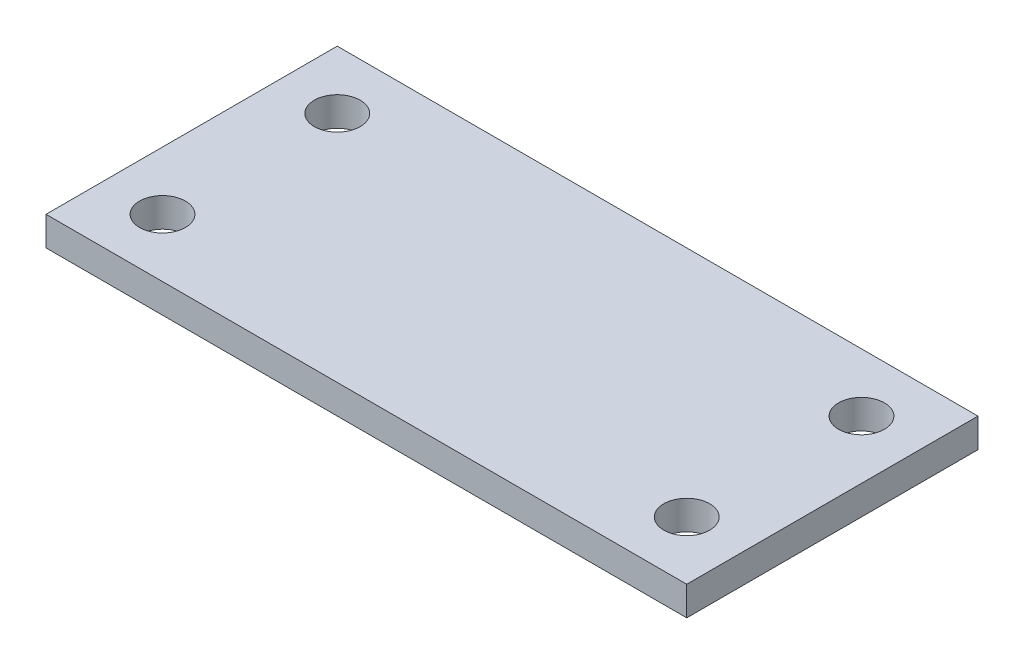
ISO-10303-21;
HEADER;
FILE_DESCRIPTION(('STEP AP214'),'2;1');
FILE_NAME('part.step','',(''),(''),'','','');
FILE_SCHEMA(('AUTOMOTIVE_DESIGN { 1 0 10303 214 1 1 1 1 }'));
ENDSEC;
DATA;
#1=APPLICATION_CONTEXT('core data for automotive mechanical design processes');
#2=APPLICATION_PROTOCOL_DEFINITION('international standard','automotive_design',2000,#1);
#3=PRODUCT_CONTEXT('',#1,'mechanical');
#4=PRODUCT('Part','Part','',(#3));
#5=PRODUCT_RELATED_PRODUCT_CATEGORY('part','',(#4));
#6=PRODUCT_DEFINITION_FORMATION('','',#4);
#7=PRODUCT_DEFINITION_CONTEXT('part definition',#1,'design');
#8=PRODUCT_DEFINITION('design','',#6,#7);
#9=PRODUCT_DEFINITION_SHAPE('','',#8);
#10=(LENGTH_UNIT() NAMED_UNIT(*) SI_UNIT(.MILLI.,.METRE.));
#11=(NAMED_UNIT(*) PLANE_ANGLE_UNIT() SI_UNIT($,.RADIAN.));
#12=(NAMED_UNIT(*) SI_UNIT($,.STERADIAN.) SOLID_ANGLE_UNIT());
#13=UNCERTAINTY_MEASURE_WITH_UNIT(LENGTH_MEASURE(1.E-05),#10,'distance_accuracy_value','');
#14=(GEOMETRIC_REPRESENTATION_CONTEXT(3) GLOBAL_UNCERTAINTY_ASSIGNED_CONTEXT((#13)) GLOBAL_UNIT_ASSIGNED_CONTEXT((#10,
#11,#12)) REPRESENTATION_CONTEXT('',''));
#15=CARTESIAN_POINT('',(0.,0.,0.));
#16=DIRECTION('',(0.,0.,1.));
#17=DIRECTION('',(1.,0.,0.));
#18=AXIS2_PLACEMENT_3D('',#15,#16,#17);
#19=CARTESIAN_POINT('',(0.,2.,-10.));
#20=DIRECTION('',(0.,0.,-1.));
#21=DIRECTION('',(-1.,0.,0.));
#22=AXIS2_PLACEMENT_3D('',#19,#20,#21);
#23=PLANE('',#22);
#24=DIRECTION('',(1.,0.,0.));
#25=VECTOR('',#24,1.);
#26=CARTESIAN_POINT('',(0.,0.,-10.));
#27=LINE('',#26,#25);
#28=CARTESIAN_POINT('',(-22.,0.,-10.));
#29=VERTEX_POINT('',#28);
#30=CARTESIAN_POINT('',(22.,0.,-10.));
#31=VERTEX_POINT('',#30);
#32=EDGE_CURVE('E107',#29,#31,#27,.T.);
#33=ORIENTED_EDGE('',*,*,#32,.F.);
#34=DIRECTION('',(0.,-1.,0.));
#35=VECTOR('',#34,1.);
#36=CARTESIAN_POINT('',(-22.,2.,-10.));
#37=LINE('',#36,#35);
#38=CARTESIAN_POINT('',(-22.,2.,-10.));
#39=VERTEX_POINT('',#38);
#40=EDGE_CURVE('E11',#39,#29,#37,.T.);
#41=ORIENTED_EDGE('',*,*,#40,.F.);
#42=DIRECTION('',(1.,0.,0.));
#43=VECTOR('',#42,1.);
#44=CARTESIAN_POINT('',(0.,2.,-10.));
#45=LINE('',#44,#43);
#46=CARTESIAN_POINT('',(22.,2.,-10.));
#47=VERTEX_POINT('',#46);
#48=EDGE_CURVE('E91',#39,#47,#45,.T.);
#49=ORIENTED_EDGE('',*,*,#48,.T.);
#50=DIRECTION('',(0.,-1.,0.));
#51=VECTOR('',#50,1.);
#52=CARTESIAN_POINT('',(22.,2.,-10.));
#53=LINE('',#52,#51);
#54=EDGE_CURVE('E53',#47,#31,#53,.T.);
#55=ORIENTED_EDGE('',*,*,#54,.T.);
#56=EDGE_LOOP('',(#33,#41,#49,#55));
#57=FACE_BOUND('',#56,.T.);
#58=ADVANCED_FACE('F36',(#57),#23,.T.);
#59=CARTESIAN_POINT('',(-22.,2.,0.));
#60=DIRECTION('',(1.,0.,0.));
#61=DIRECTION('',(0.,0.,-1.));
#62=AXIS2_PLACEMENT_3D('',#59,#60,#61);
#63=PLANE('',#62);
#64=DIRECTION('',(0.,0.,1.));
#65=VECTOR('',#64,1.);
#66=CARTESIAN_POINT('',(-22.,0.,0.));
#67=LINE('',#66,#65);
#68=CARTESIAN_POINT('',(-22.,0.,10.));
#69=VERTEX_POINT('',#68);
#70=EDGE_CURVE('E96',#29,#69,#67,.T.);
#71=ORIENTED_EDGE('',*,*,#70,.T.);
#72=DIRECTION('',(0.,-1.,0.));
#73=VECTOR('',#72,1.);
#74=CARTESIAN_POINT('',(-22.,2.,10.));
#75=LINE('',#74,#73);
#76=CARTESIAN_POINT('',(-22.,2.,10.));
#77=VERTEX_POINT('',#76);
#78=EDGE_CURVE('E45',#77,#69,#75,.T.);
#79=ORIENTED_EDGE('',*,*,#78,.F.);
#80=DIRECTION('',(0.,0.,1.));
#81=VECTOR('',#80,1.);
#82=CARTESIAN_POINT('',(-22.,2.,0.));
#83=LINE('',#82,#81);
#84=EDGE_CURVE('E87',#39,#77,#83,.T.);
#85=ORIENTED_EDGE('',*,*,#84,.F.);
#86=ORIENTED_EDGE('',*,*,#40,.T.);
#87=EDGE_LOOP('',(#71,#79,#85,#86));
#88=FACE_BOUND('',#87,.T.);
#89=ADVANCED_FACE('F94',(#88),#63,.F.);
#90=CARTESIAN_POINT('',(0.,2.,10.));
#91=DIRECTION('',(0.,0.,-1.));
#92=DIRECTION('',(-1.,0.,0.));
#93=AXIS2_PLACEMENT_3D('',#90,#91,#92);
#94=PLANE('',#93);
#95=DIRECTION('',(1.,0.,0.));
#96=VECTOR('',#95,1.);
#97=CARTESIAN_POINT('',(0.,0.,10.));
#98=LINE('',#97,#96);
#99=CARTESIAN_POINT('',(22.,0.,10.));
#100=VERTEX_POINT('',#99);
#101=EDGE_CURVE('E104',#69,#100,#98,.T.);
#102=ORIENTED_EDGE('',*,*,#101,.T.);
#103=DIRECTION('',(0.,-1.,0.));
#104=VECTOR('',#103,1.);
#105=CARTESIAN_POINT('',(22.,2.,10.));
#106=LINE('',#105,#104);
#107=CARTESIAN_POINT('',(22.,2.,10.));
#108=VERTEX_POINT('',#107);
#109=EDGE_CURVE('E67',#108,#100,#106,.T.);
#110=ORIENTED_EDGE('',*,*,#109,.F.);
#111=DIRECTION('',(1.,0.,0.));
#112=VECTOR('',#111,1.);
#113=CARTESIAN_POINT('',(0.,2.,10.));
#114=LINE('',#113,#112);
#115=EDGE_CURVE('E79',#77,#108,#114,.T.);
#116=ORIENTED_EDGE('',*,*,#115,.F.);
#117=ORIENTED_EDGE('',*,*,#78,.T.);
#118=EDGE_LOOP('',(#102,#110,#116,#117));
#119=FACE_BOUND('',#118,.T.);
#120=ADVANCED_FACE('F81',(#119),#94,.F.);
#121=CARTESIAN_POINT('',(-18.,2.,-6.));
#122=DIRECTION('',(0.,-1.,0.));
#123=DIRECTION('',(0.,0.,-1.));
#124=AXIS2_PLACEMENT_3D('',#121,#122,#123);
#125=CYLINDRICAL_SURFACE('',#124,1.575);
#126=CARTESIAN_POINT('',(-18.,2.,-6.));
#127=DIRECTION('',(0.,1.,0.));
#128=DIRECTION('',(0.,0.,1.));
#129=AXIS2_PLACEMENT_3D('',#126,#127,#128);
#130=CIRCLE('',#129,1.575);
#131=CARTESIAN_POINT('',(-18.,2.,-4.425));
#132=VERTEX_POINT('',#131);
#133=EDGE_CURVE('E123',#132,#132,#130,.T.);
#134=ORIENTED_EDGE('',*,*,#133,.T.);
#135=EDGE_LOOP('',(#134));
#136=FACE_BOUND('',#135,.T.);
#137=CARTESIAN_POINT('',(-18.,0.,-6.));
#138=DIRECTION('',(0.,1.,0.));
#139=DIRECTION('',(0.,0.,1.));
#140=AXIS2_PLACEMENT_3D('',#137,#138,#139);
#141=CIRCLE('',#140,1.575);
#142=CARTESIAN_POINT('',(-18.,0.,-4.425));
#143=VERTEX_POINT('',#142);
#144=EDGE_CURVE('E109',#143,#143,#141,.T.);
#145=ORIENTED_EDGE('',*,*,#144,.F.);
#146=EDGE_LOOP('',(#145));
#147=FACE_BOUND('',#146,.T.);
#148=ADVANCED_FACE('F148',(#136,#147),#125,.F.);
#149=CARTESIAN_POINT('',(18.,2.,6.));
#150=DIRECTION('',(0.,-1.,0.));
#151=DIRECTION('',(0.,0.,-1.));
#152=AXIS2_PLACEMENT_3D('',#149,#150,#151);
#153=CYLINDRICAL_SURFACE('',#152,1.575);
#154=CARTESIAN_POINT('',(18.,2.,6.));
#155=DIRECTION('',(0.,1.,0.));
#156=DIRECTION('',(0.,0.,1.));
#157=AXIS2_PLACEMENT_3D('',#154,#155,#156);
#158=CIRCLE('',#157,1.575);
#159=CARTESIAN_POINT('',(18.,2.,7.575));
#160=VERTEX_POINT('',#159);
#161=EDGE_CURVE('E126',#160,#160,#158,.T.);
#162=ORIENTED_EDGE('',*,*,#161,.T.);
#163=EDGE_LOOP('',(#162));
#164=FACE_BOUND('',#163,.T.);
#165=CARTESIAN_POINT('',(18.,0.,6.));
#166=DIRECTION('',(0.,1.,0.));
#167=DIRECTION('',(0.,0.,1.));
#168=AXIS2_PLACEMENT_3D('',#165,#166,#167);
#169=CIRCLE('',#168,1.575);
#170=CARTESIAN_POINT('',(18.,0.,7.575));
#171=VERTEX_POINT('',#170);
#172=EDGE_CURVE('E112',#171,#171,#169,.T.);
#173=ORIENTED_EDGE('',*,*,#172,.F.);
#174=EDGE_LOOP('',(#173));
#175=FACE_BOUND('',#174,.T.);
#176=ADVANCED_FACE('F151',(#164,#175),#153,.F.);
#177=CARTESIAN_POINT('',(18.,2.,-6.));
#178=DIRECTION('',(0.,-1.,0.));
#179=DIRECTION('',(0.,0.,-1.));
#180=AXIS2_PLACEMENT_3D('',#177,#178,#179);
#181=CYLINDRICAL_SURFACE('',#180,1.575);
#182=CARTESIAN_POINT('',(18.,2.,-6.));
#183=DIRECTION('',(0.,1.,0.));
#184=DIRECTION('',(0.,0.,1.));
#185=AXIS2_PLACEMENT_3D('',#182,#183,#184);
#186=CIRCLE('',#185,1.575);
#187=CARTESIAN_POINT('',(18.,2.,-4.425));
#188=VERTEX_POINT('',#187);
#189=EDGE_CURVE('E129',#188,#188,#186,.T.);
#190=ORIENTED_EDGE('',*,*,#189,.T.);
#191=EDGE_LOOP('',(#190));
#192=FACE_BOUND('',#191,.T.);
#193=CARTESIAN_POINT('',(18.,0.,-6.));
#194=DIRECTION('',(0.,1.,0.));
#195=DIRECTION('',(0.,0.,1.));
#196=AXIS2_PLACEMENT_3D('',#193,#194,#195);
#197=CIRCLE('',#196,1.575);
#198=CARTESIAN_POINT('',(18.,0.,-4.425));
#199=VERTEX_POINT('',#198);
#200=EDGE_CURVE('E115',#199,#199,#197,.T.);
#201=ORIENTED_EDGE('',*,*,#200,.F.);
#202=EDGE_LOOP('',(#201));
#203=FACE_BOUND('',#202,.T.);
#204=ADVANCED_FACE('F164',(#192,#203),#181,.F.);
#205=CARTESIAN_POINT('',(-18.,2.,6.));
#206=DIRECTION('',(0.,-1.,0.));
#207=DIRECTION('',(0.,0.,-1.));
#208=AXIS2_PLACEMENT_3D('',#205,#206,#207);
#209=CYLINDRICAL_SURFACE('',#208,1.575);
#210=CARTESIAN_POINT('',(-18.,2.,6.));
#211=DIRECTION('',(0.,1.,0.));
#212=DIRECTION('',(0.,0.,1.));
#213=AXIS2_PLACEMENT_3D('',#210,#211,#212);
#214=CIRCLE('',#213,1.575);
#215=CARTESIAN_POINT('',(-18.,2.,7.575));
#216=VERTEX_POINT('',#215);
#217=EDGE_CURVE('E103',#216,#216,#214,.T.);
#218=ORIENTED_EDGE('',*,*,#217,.T.);
#219=EDGE_LOOP('',(#218));
#220=FACE_BOUND('',#219,.T.);
#221=CARTESIAN_POINT('',(-18.,0.,6.));
#222=DIRECTION('',(0.,1.,0.));
#223=DIRECTION('',(0.,0.,1.));
#224=AXIS2_PLACEMENT_3D('',#221,#222,#223);
#225=CIRCLE('',#224,1.575);
#226=CARTESIAN_POINT('',(-18.,0.,7.575));
#227=VERTEX_POINT('',#226);
#228=EDGE_CURVE('E118',#227,#227,#225,.T.);
#229=ORIENTED_EDGE('',*,*,#228,.F.);
#230=EDGE_LOOP('',(#229));
#231=FACE_BOUND('',#230,.T.);
#232=ADVANCED_FACE('F38',(#220,#231),#209,.F.);
#233=CARTESIAN_POINT('',(22.,2.,0.));
#234=DIRECTION('',(1.,0.,0.));
#235=DIRECTION('',(0.,0.,-1.));
#236=AXIS2_PLACEMENT_3D('',#233,#234,#235);
#237=PLANE('',#236);
#238=DIRECTION('',(0.,0.,1.));
#239=VECTOR('',#238,1.);
#240=CARTESIAN_POINT('',(22.,0.,0.));
#241=LINE('',#240,#239);
#242=EDGE_CURVE('E100',#31,#100,#241,.T.);
#243=ORIENTED_EDGE('',*,*,#242,.F.);
#244=ORIENTED_EDGE('',*,*,#54,.F.);
#245=DIRECTION('',(0.,0.,1.));
#246=VECTOR('',#245,1.);
#247=CARTESIAN_POINT('',(22.,2.,0.));
#248=LINE('',#247,#246);
#249=EDGE_CURVE('E86',#47,#108,#248,.T.);
#250=ORIENTED_EDGE('',*,*,#249,.T.);
#251=ORIENTED_EDGE('',*,*,#109,.T.);
#252=EDGE_LOOP('',(#243,#244,#250,#251));
#253=FACE_BOUND('',#252,.T.);
#254=ADVANCED_FACE('F140',(#253),#237,.T.);
#255=CARTESIAN_POINT('',(0.,2.,0.));
#256=DIRECTION('',(0.,1.,0.));
#257=DIRECTION('',(0.,0.,1.));
#258=AXIS2_PLACEMENT_3D('',#255,#256,#257);
#259=PLANE('',#258);
#260=ORIENTED_EDGE('',*,*,#217,.F.);
#261=EDGE_LOOP('',(#260));
#262=FACE_BOUND('',#261,.T.);
#263=ORIENTED_EDGE('',*,*,#189,.F.);
#264=EDGE_LOOP('',(#263));
#265=FACE_BOUND('',#264,.T.);
#266=ORIENTED_EDGE('',*,*,#161,.F.);
#267=EDGE_LOOP('',(#266));
#268=FACE_BOUND('',#267,.T.);
#269=ORIENTED_EDGE('',*,*,#133,.F.);
#270=EDGE_LOOP('',(#269));
#271=FACE_BOUND('',#270,.T.);
#272=ORIENTED_EDGE('',*,*,#48,.F.);
#273=ORIENTED_EDGE('',*,*,#84,.T.);
#274=ORIENTED_EDGE('',*,*,#115,.T.);
#275=ORIENTED_EDGE('',*,*,#249,.F.);
#276=EDGE_LOOP('',(#272,#273,#274,#275));
#277=FACE_BOUND('',#276,.T.);
#278=ADVANCED_FACE('F90',(#262,#265,#268,#271,#277),#259,.T.);
#279=CARTESIAN_POINT('',(0.,0.,0.));
#280=DIRECTION('',(0.,1.,0.));
#281=DIRECTION('',(0.,0.,1.));
#282=AXIS2_PLACEMENT_3D('',#279,#280,#281);
#283=PLANE('',#282);
#284=ORIENTED_EDGE('',*,*,#228,.T.);
#285=EDGE_LOOP('',(#284));
#286=FACE_BOUND('',#285,.T.);
#287=ORIENTED_EDGE('',*,*,#200,.T.);
#288=EDGE_LOOP('',(#287));
#289=FACE_BOUND('',#288,.T.);
#290=ORIENTED_EDGE('',*,*,#172,.T.);
#291=EDGE_LOOP('',(#290));
#292=FACE_BOUND('',#291,.T.);
#293=ORIENTED_EDGE('',*,*,#144,.T.);
#294=EDGE_LOOP('',(#293));
#295=FACE_BOUND('',#294,.T.);
#296=ORIENTED_EDGE('',*,*,#32,.T.);
#297=ORIENTED_EDGE('',*,*,#242,.T.);
#298=ORIENTED_EDGE('',*,*,#101,.F.);
#299=ORIENTED_EDGE('',*,*,#70,.F.);
#300=EDGE_LOOP('',(#296,#297,#298,#299));
#301=FACE_BOUND('',#300,.T.);
#302=ADVANCED_FACE('F139',(#286,#289,#292,#295,#301),#283,.F.);
#303=CLOSED_SHELL('',(#58,#89,#120,#148,#176,#204,#232,#254,#278,#302));
#304=MANIFOLD_SOLID_BREP('B2',#303);
#305=ADVANCED_BREP_SHAPE_REPRESENTATION('',(#18,#304),#14);
#306=SHAPE_DEFINITION_REPRESENTATION(#9,#305);
ENDSEC;
END-ISO-10303-21;
